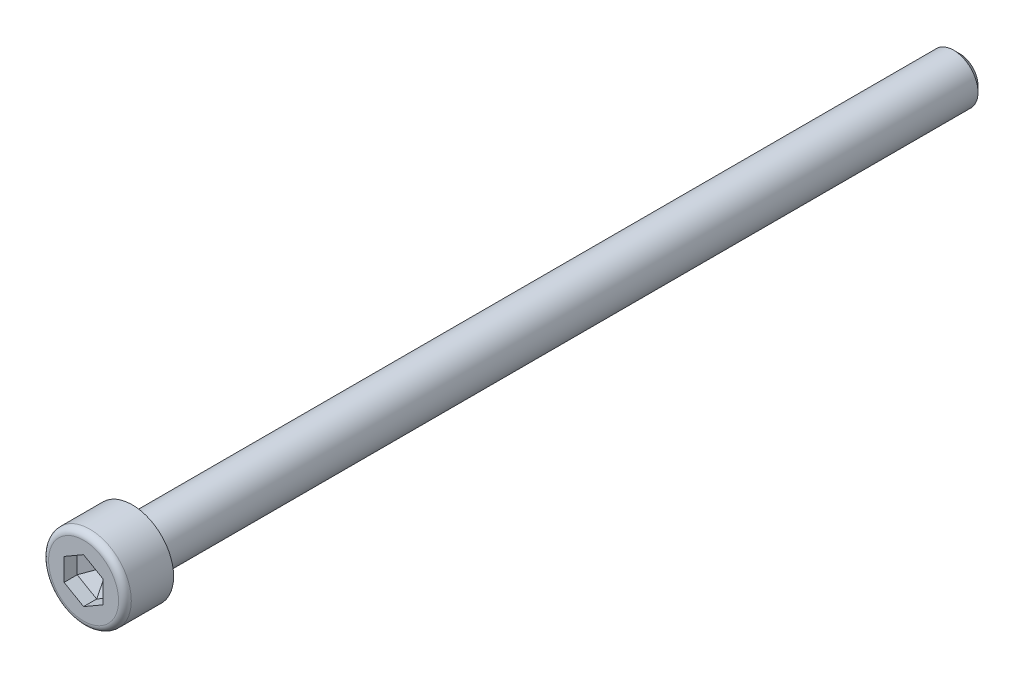
ISO-10303-21;
HEADER;
FILE_DESCRIPTION(('STEP AP214'),'2;1');
FILE_NAME('part.step','',(''),(''),'','','');
FILE_SCHEMA(('AUTOMOTIVE_DESIGN { 1 0 10303 214 1 1 1 1 }'));
ENDSEC;
DATA;
#1=APPLICATION_CONTEXT('core data for automotive mechanical design processes');
#2=APPLICATION_PROTOCOL_DEFINITION('international standard','automotive_design',2000,#1);
#3=PRODUCT_CONTEXT('',#1,'mechanical');
#4=PRODUCT('Part','Part','',(#3));
#5=PRODUCT_RELATED_PRODUCT_CATEGORY('part','',(#4));
#6=PRODUCT_DEFINITION_FORMATION('','',#4);
#7=PRODUCT_DEFINITION_CONTEXT('part definition',#1,'design');
#8=PRODUCT_DEFINITION('design','',#6,#7);
#9=PRODUCT_DEFINITION_SHAPE('','',#8);
#10=(LENGTH_UNIT() NAMED_UNIT(*) SI_UNIT(.MILLI.,.METRE.));
#11=(NAMED_UNIT(*) PLANE_ANGLE_UNIT() SI_UNIT($,.RADIAN.));
#12=(NAMED_UNIT(*) SI_UNIT($,.STERADIAN.) SOLID_ANGLE_UNIT());
#13=UNCERTAINTY_MEASURE_WITH_UNIT(LENGTH_MEASURE(1.E-05),#10,'distance_accuracy_value','');
#14=(GEOMETRIC_REPRESENTATION_CONTEXT(3) GLOBAL_UNCERTAINTY_ASSIGNED_CONTEXT((#13)) GLOBAL_UNIT_ASSIGNED_CONTEXT((#10,
#11,#12)) REPRESENTATION_CONTEXT('',''));
#15=CARTESIAN_POINT('',(0.,0.,0.));
#16=DIRECTION('',(0.,0.,1.));
#17=DIRECTION('',(1.,0.,0.));
#18=AXIS2_PLACEMENT_3D('',#15,#16,#17);
#19=CARTESIAN_POINT('',(0.,0.,0.));
#20=DIRECTION('',(0.,0.,1.));
#21=DIRECTION('',(1.,0.,0.));
#22=AXIS2_PLACEMENT_3D('',#19,#20,#21);
#23=PLANE('',#22);
#24=CARTESIAN_POINT('',(0.,0.,0.));
#25=DIRECTION('',(0.,0.,1.));
#26=DIRECTION('',(1.,0.,0.));
#27=AXIS2_PLACEMENT_3D('',#24,#25,#26);
#28=CIRCLE('',#27,2.6);
#29=CARTESIAN_POINT('',(2.6,0.,0.));
#30=VERTEX_POINT('',#29);
#31=EDGE_CURVE('E11',#30,#30,#28,.T.);
#32=ORIENTED_EDGE('',*,*,#31,.T.);
#33=EDGE_LOOP('',(#32));
#34=FACE_BOUND('',#33,.T.);
#35=CARTESIAN_POINT('',(0.,0.,0.));
#36=DIRECTION('',(0.,0.,1.));
#37=DIRECTION('',(1.,0.,0.));
#38=AXIS2_PLACEMENT_3D('',#35,#36,#37);
#39=CIRCLE('',#38,4.25);
#40=CARTESIAN_POINT('',(4.25,0.,0.));
#41=VERTEX_POINT('',#40);
#42=EDGE_CURVE('E154',#41,#41,#39,.T.);
#43=ORIENTED_EDGE('',*,*,#42,.F.);
#44=EDGE_LOOP('',(#43));
#45=FACE_BOUND('',#44,.T.);
#46=ADVANCED_FACE('F44',(#34,#45),#23,.F.);
#47=CARTESIAN_POINT('',(0.,0.,5.));
#48=DIRECTION('',(0.,0.,-1.));
#49=DIRECTION('',(-1.,0.,0.));
#50=AXIS2_PLACEMENT_3D('',#47,#48,#49);
#51=CYLINDRICAL_SURFACE('',#50,4.25);
#52=CARTESIAN_POINT('',(0.,0.,4.34615384615385));
#53=DIRECTION('',(0.,0.,1.));
#54=DIRECTION('',(1.,0.,0.));
#55=AXIS2_PLACEMENT_3D('',#52,#53,#54);
#56=CIRCLE('',#55,4.25);
#57=CARTESIAN_POINT('',(4.25,0.,4.34615384615385));
#58=VERTEX_POINT('',#57);
#59=EDGE_CURVE('E172',#58,#58,#56,.F.);
#60=ORIENTED_EDGE('',*,*,#59,.T.);
#61=EDGE_LOOP('',(#60));
#62=FACE_BOUND('',#61,.T.);
#63=ORIENTED_EDGE('',*,*,#42,.T.);
#64=EDGE_LOOP('',(#63));
#65=FACE_BOUND('',#64,.T.);
#66=ADVANCED_FACE('F231',(#62,#65),#51,.T.);
#67=CARTESIAN_POINT('',(0.,0.,5.));
#68=DIRECTION('',(0.,0.,1.));
#69=DIRECTION('',(1.,0.,0.));
#70=AXIS2_PLACEMENT_3D('',#67,#68,#69);
#71=PLANE('',#70);
#72=CARTESIAN_POINT('',(0.,0.,5.));
#73=DIRECTION('',(0.,0.,1.));
#74=DIRECTION('',(1.,0.,0.));
#75=AXIS2_PLACEMENT_3D('',#72,#73,#74);
#76=CIRCLE('',#75,3.59615384615385);
#77=CARTESIAN_POINT('',(3.59615384615385,0.,5.));
#78=VERTEX_POINT('',#77);
#79=EDGE_CURVE('E169',#78,#78,#76,.T.);
#80=ORIENTED_EDGE('',*,*,#79,.T.);
#81=EDGE_LOOP('',(#80));
#82=FACE_BOUND('',#81,.T.);
#83=DIRECTION('',(0.,1.,0.));
#84=VECTOR('',#83,1.);
#85=CARTESIAN_POINT('',(2.,-1.15470053837925,5.));
#86=LINE('',#85,#84);
#87=CARTESIAN_POINT('',(2.,-1.15470053837925,5.));
#88=VERTEX_POINT('',#87);
#89=CARTESIAN_POINT('',(2.,1.15470053837925,5.));
#90=VERTEX_POINT('',#89);
#91=EDGE_CURVE('E136',#88,#90,#86,.T.);
#92=ORIENTED_EDGE('',*,*,#91,.F.);
#93=DIRECTION('',(0.866025403784439,0.5,0.));
#94=VECTOR('',#93,1.);
#95=CARTESIAN_POINT('',(0.,-2.3094010767585,5.));
#96=LINE('',#95,#94);
#97=CARTESIAN_POINT('',(0.,-2.3094010767585,5.));
#98=VERTEX_POINT('',#97);
#99=EDGE_CURVE('E149',#98,#88,#96,.T.);
#100=ORIENTED_EDGE('',*,*,#99,.F.);
#101=DIRECTION('',(0.866025403784439,-0.5,0.));
#102=VECTOR('',#101,1.);
#103=CARTESIAN_POINT('',(-2.,-1.15470053837925,5.));
#104=LINE('',#103,#102);
#105=CARTESIAN_POINT('',(-2.,-1.15470053837925,5.));
#106=VERTEX_POINT('',#105);
#107=EDGE_CURVE('E143',#106,#98,#104,.T.);
#108=ORIENTED_EDGE('',*,*,#107,.F.);
#109=DIRECTION('',(0.,-1.,0.));
#110=VECTOR('',#109,1.);
#111=CARTESIAN_POINT('',(-2.,1.15470053837925,5.));
#112=LINE('',#111,#110);
#113=CARTESIAN_POINT('',(-2.,1.15470053837925,5.));
#114=VERTEX_POINT('',#113);
#115=EDGE_CURVE('E141',#114,#106,#112,.T.);
#116=ORIENTED_EDGE('',*,*,#115,.F.);
#117=DIRECTION('',(-0.866025403784439,-0.5,0.));
#118=VECTOR('',#117,1.);
#119=CARTESIAN_POINT('',(0.,2.3094010767585,5.));
#120=LINE('',#119,#118);
#121=CARTESIAN_POINT('',(0.,2.3094010767585,5.));
#122=VERTEX_POINT('',#121);
#123=EDGE_CURVE('E121',#122,#114,#120,.T.);
#124=ORIENTED_EDGE('',*,*,#123,.F.);
#125=DIRECTION('',(-0.866025403784439,0.5,0.));
#126=VECTOR('',#125,1.);
#127=CARTESIAN_POINT('',(2.,1.15470053837925,5.));
#128=LINE('',#127,#126);
#129=EDGE_CURVE('E131',#90,#122,#128,.T.);
#130=ORIENTED_EDGE('',*,*,#129,.F.);
#131=EDGE_LOOP('',(#92,#100,#108,#116,#124,#130));
#132=FACE_BOUND('',#131,.T.);
#133=ADVANCED_FACE('F138',(#82,#132),#71,.T.);
#134=CARTESIAN_POINT('',(2.,-1.15470053837925,2.5));
#135=DIRECTION('',(1.,0.,0.));
#136=DIRECTION('',(0.,0.,-1.));
#137=AXIS2_PLACEMENT_3D('',#134,#135,#136);
#138=PLANE('',#137);
#139=DIRECTION('',(0.,0.,1.));
#140=VECTOR('',#139,1.);
#141=CARTESIAN_POINT('',(2.,1.15470053837925,2.5));
#142=LINE('',#141,#140);
#143=CARTESIAN_POINT('',(2.,1.15470053837925,3.65273775216138));
#144=VERTEX_POINT('',#143);
#145=EDGE_CURVE('E128',#144,#90,#142,.T.);
#146=ORIENTED_EDGE('',*,*,#145,.F.);
#147=DIRECTION('',(0.,-1.,0.));
#148=VECTOR('',#147,1.);
#149=CARTESIAN_POINT('',(2.,-1.15470053837925,3.65273775216138));
#150=LINE('',#149,#148);
#151=CARTESIAN_POINT('',(2.,-1.15470053837925,3.65273775216138));
#152=VERTEX_POINT('',#151);
#153=EDGE_CURVE('E67',#144,#152,#150,.T.);
#154=ORIENTED_EDGE('',*,*,#153,.T.);
#155=DIRECTION('',(0.,0.,1.));
#156=VECTOR('',#155,1.);
#157=CARTESIAN_POINT('',(2.,-1.15470053837925,2.5));
#158=LINE('',#157,#156);
#159=EDGE_CURVE('E152',#152,#88,#158,.T.);
#160=ORIENTED_EDGE('',*,*,#159,.T.);
#161=ORIENTED_EDGE('',*,*,#91,.T.);
#162=EDGE_LOOP('',(#146,#154,#160,#161));
#163=FACE_BOUND('',#162,.T.);
#164=ADVANCED_FACE('F291',(#163),#138,.F.);
#165=CARTESIAN_POINT('',(0.,-2.3094010767585,2.5));
#166=DIRECTION('',(0.5,-0.866025403784439,0.));
#167=DIRECTION('',(0.866025403784439,0.5,0.));
#168=AXIS2_PLACEMENT_3D('',#165,#166,#167);
#169=PLANE('',#168);
#170=ORIENTED_EDGE('',*,*,#159,.F.);
#171=DIRECTION('',(-0.866025403784439,-0.5,0.));
#172=VECTOR('',#171,1.);
#173=CARTESIAN_POINT('',(0.,-2.3094010767585,3.65273775216138));
#174=LINE('',#173,#172);
#175=CARTESIAN_POINT('',(0.,-2.3094010767585,3.65273775216138));
#176=VERTEX_POINT('',#175);
#177=EDGE_CURVE('E59',#152,#176,#174,.T.);
#178=ORIENTED_EDGE('',*,*,#177,.T.);
#179=DIRECTION('',(0.,0.,1.));
#180=VECTOR('',#179,1.);
#181=CARTESIAN_POINT('',(0.,-2.3094010767585,2.5));
#182=LINE('',#181,#180);
#183=EDGE_CURVE('E155',#176,#98,#182,.T.);
#184=ORIENTED_EDGE('',*,*,#183,.T.);
#185=ORIENTED_EDGE('',*,*,#99,.T.);
#186=EDGE_LOOP('',(#170,#178,#184,#185));
#187=FACE_BOUND('',#186,.T.);
#188=ADVANCED_FACE('F293',(#187),#169,.F.);
#189=CARTESIAN_POINT('',(-2.,-1.15470053837925,2.5));
#190=DIRECTION('',(-0.5,-0.866025403784439,0.));
#191=DIRECTION('',(0.866025403784439,-0.5,0.));
#192=AXIS2_PLACEMENT_3D('',#189,#190,#191);
#193=PLANE('',#192);
#194=ORIENTED_EDGE('',*,*,#183,.F.);
#195=DIRECTION('',(-0.866025403784439,0.5,0.));
#196=VECTOR('',#195,1.);
#197=CARTESIAN_POINT('',(-2.,-1.15470053837925,3.65273775216138));
#198=LINE('',#197,#196);
#199=CARTESIAN_POINT('',(-2.,-1.15470053837925,3.65273775216138));
#200=VERTEX_POINT('',#199);
#201=EDGE_CURVE('E195',#176,#200,#198,.T.);
#202=ORIENTED_EDGE('',*,*,#201,.T.);
#203=DIRECTION('',(0.,0.,1.));
#204=VECTOR('',#203,1.);
#205=CARTESIAN_POINT('',(-2.,-1.15470053837925,2.5));
#206=LINE('',#205,#204);
#207=EDGE_CURVE('E157',#200,#106,#206,.T.);
#208=ORIENTED_EDGE('',*,*,#207,.T.);
#209=ORIENTED_EDGE('',*,*,#107,.T.);
#210=EDGE_LOOP('',(#194,#202,#208,#209));
#211=FACE_BOUND('',#210,.T.);
#212=ADVANCED_FACE('F282',(#211),#193,.F.);
#213=CARTESIAN_POINT('',(-2.,1.15470053837925,2.5));
#214=DIRECTION('',(-1.,0.,0.));
#215=DIRECTION('',(0.,0.,1.));
#216=AXIS2_PLACEMENT_3D('',#213,#214,#215);
#217=PLANE('',#216);
#218=ORIENTED_EDGE('',*,*,#207,.F.);
#219=DIRECTION('',(0.,1.,0.));
#220=VECTOR('',#219,1.);
#221=CARTESIAN_POINT('',(-2.,1.15470053837925,3.65273775216138));
#222=LINE('',#221,#220);
#223=CARTESIAN_POINT('',(-2.,1.15470053837925,3.65273775216138));
#224=VERTEX_POINT('',#223);
#225=EDGE_CURVE('E188',#200,#224,#222,.T.);
#226=ORIENTED_EDGE('',*,*,#225,.T.);
#227=DIRECTION('',(0.,0.,1.));
#228=VECTOR('',#227,1.);
#229=CARTESIAN_POINT('',(-2.,1.15470053837925,2.5));
#230=LINE('',#229,#228);
#231=EDGE_CURVE('E127',#224,#114,#230,.T.);
#232=ORIENTED_EDGE('',*,*,#231,.T.);
#233=ORIENTED_EDGE('',*,*,#115,.T.);
#234=EDGE_LOOP('',(#218,#226,#232,#233));
#235=FACE_BOUND('',#234,.T.);
#236=ADVANCED_FACE('F285',(#235),#217,.F.);
#237=CARTESIAN_POINT('',(0.,2.3094010767585,2.5));
#238=DIRECTION('',(-0.5,0.866025403784439,0.));
#239=DIRECTION('',(-0.866025403784439,-0.5,0.));
#240=AXIS2_PLACEMENT_3D('',#237,#238,#239);
#241=PLANE('',#240);
#242=ORIENTED_EDGE('',*,*,#231,.F.);
#243=DIRECTION('',(0.866025403784439,0.5,0.));
#244=VECTOR('',#243,1.);
#245=CARTESIAN_POINT('',(0.,2.3094010767585,3.65273775216138));
#246=LINE('',#245,#244);
#247=CARTESIAN_POINT('',(0.,2.3094010767585,3.65273775216138));
#248=VERTEX_POINT('',#247);
#249=EDGE_CURVE('E124',#224,#248,#246,.T.);
#250=ORIENTED_EDGE('',*,*,#249,.T.);
#251=DIRECTION('',(0.,0.,1.));
#252=VECTOR('',#251,1.);
#253=CARTESIAN_POINT('',(0.,2.3094010767585,2.5));
#254=LINE('',#253,#252);
#255=EDGE_CURVE('E116',#248,#122,#254,.T.);
#256=ORIENTED_EDGE('',*,*,#255,.T.);
#257=ORIENTED_EDGE('',*,*,#123,.T.);
#258=EDGE_LOOP('',(#242,#250,#256,#257));
#259=FACE_BOUND('',#258,.T.);
#260=ADVANCED_FACE('F119',(#259),#241,.F.);
#261=CARTESIAN_POINT('',(2.,1.15470053837925,2.5));
#262=DIRECTION('',(0.5,0.866025403784439,0.));
#263=DIRECTION('',(-0.866025403784439,0.5,0.));
#264=AXIS2_PLACEMENT_3D('',#261,#262,#263);
#265=PLANE('',#264);
#266=ORIENTED_EDGE('',*,*,#255,.F.);
#267=DIRECTION('',(0.866025403784439,-0.5,0.));
#268=VECTOR('',#267,1.);
#269=CARTESIAN_POINT('',(2.,1.15470053837925,3.65273775216138));
#270=LINE('',#269,#268);
#271=EDGE_CURVE('E192',#248,#144,#270,.T.);
#272=ORIENTED_EDGE('',*,*,#271,.T.);
#273=ORIENTED_EDGE('',*,*,#145,.T.);
#274=ORIENTED_EDGE('',*,*,#129,.T.);
#275=EDGE_LOOP('',(#266,#272,#273,#274));
#276=FACE_BOUND('',#275,.T.);
#277=ADVANCED_FACE('F132',(#276),#265,.F.);
#278=CARTESIAN_POINT('',(0.,0.,2.5));
#279=DIRECTION('',(0.,0.,1.));
#280=DIRECTION('',(1.,0.,0.));
#281=AXIS2_PLACEMENT_3D('',#278,#279,#280);
#282=PLANE('',#281);
#283=DIRECTION('',(-0.866025403784439,-0.5,0.));
#284=VECTOR('',#283,1.);
#285=CARTESIAN_POINT('',(-0.00169982272685992,0.00294417932678165,2.5));
#286=LINE('',#285,#284);
#287=CARTESIAN_POINT('',(0.,0.00392557243570869,2.5));
#288=VERTEX_POINT('',#287);
#289=CARTESIAN_POINT('',(-0.00339964545371935,0.00196278621785459,2.5));
#290=VERTEX_POINT('',#289);
#291=EDGE_CURVE('E183',#288,#290,#286,.T.);
#292=ORIENTED_EDGE('',*,*,#291,.T.);
#293=DIRECTION('',(0.,-1.,0.));
#294=VECTOR('',#293,1.);
#295=CARTESIAN_POINT('',(-0.0033996454537194,0.,2.5));
#296=LINE('',#295,#294);
#297=CARTESIAN_POINT('',(-0.0033996454537194,-0.00196278621785428,2.5));
#298=VERTEX_POINT('',#297);
#299=EDGE_CURVE('E185',#290,#298,#296,.T.);
#300=ORIENTED_EDGE('',*,*,#299,.T.);
#301=DIRECTION('',(0.866025403784439,-0.5,0.));
#302=VECTOR('',#301,1.);
#303=CARTESIAN_POINT('',(-0.00169982272685976,-0.00294417932678137,2.5));
#304=LINE('',#303,#302);
#305=CARTESIAN_POINT('',(0.,-0.00392557243570875,2.5));
#306=VERTEX_POINT('',#305);
#307=EDGE_CURVE('E177',#298,#306,#304,.T.);
#308=ORIENTED_EDGE('',*,*,#307,.T.);
#309=DIRECTION('',(0.866025403784439,0.5,0.));
#310=VECTOR('',#309,1.);
#311=CARTESIAN_POINT('',(0.00169982272685997,-0.00294417932678175,2.5));
#312=LINE('',#311,#310);
#313=CARTESIAN_POINT('',(0.0033996454537194,-0.00196278621785478,2.5));
#314=VERTEX_POINT('',#313);
#315=EDGE_CURVE('E175',#306,#314,#312,.T.);
#316=ORIENTED_EDGE('',*,*,#315,.T.);
#317=DIRECTION('',(0.,1.,0.));
#318=VECTOR('',#317,1.);
#319=CARTESIAN_POINT('',(0.0033996454537194,0.,2.5));
#320=LINE('',#319,#318);
#321=CARTESIAN_POINT('',(0.0033996454537194,0.00196278621785453,2.5));
#322=VERTEX_POINT('',#321);
#323=EDGE_CURVE('E179',#314,#322,#320,.T.);
#324=ORIENTED_EDGE('',*,*,#323,.T.);
#325=DIRECTION('',(-0.866025403784439,0.5,0.));
#326=VECTOR('',#325,1.);
#327=CARTESIAN_POINT('',(0.00169982272685981,0.00294417932678146,2.5));
#328=LINE('',#327,#326);
#329=EDGE_CURVE('E181',#322,#288,#328,.T.);
#330=ORIENTED_EDGE('',*,*,#329,.T.);
#331=EDGE_LOOP('',(#292,#300,#308,#316,#324,#330));
#332=FACE_BOUND('',#331,.T.);
#333=ADVANCED_FACE('F302',(#332),#282,.T.);
#334=CARTESIAN_POINT('',(0.,0.,-85.));
#335=DIRECTION('',(0.,0.,1.));
#336=DIRECTION('',(1.,0.,0.));
#337=AXIS2_PLACEMENT_3D('',#334,#335,#336);
#338=CYLINDRICAL_SURFACE('',#337,2.5);
#339=CARTESIAN_POINT('',(0.,0.,-0.100000000000003));
#340=DIRECTION('',(0.,0.,1.));
#341=DIRECTION('',(1.,0.,0.));
#342=AXIS2_PLACEMENT_3D('',#339,#340,#341);
#343=CIRCLE('',#342,2.5);
#344=CARTESIAN_POINT('',(2.5,0.,-0.100000000000003));
#345=VERTEX_POINT('',#344);
#346=EDGE_CURVE('E52',#345,#345,#343,.F.);
#347=ORIENTED_EDGE('',*,*,#346,.T.);
#348=EDGE_LOOP('',(#347));
#349=FACE_BOUND('',#348,.T.);
#350=CARTESIAN_POINT('',(0.,0.,-84.375));
#351=DIRECTION('',(0.,0.,-1.));
#352=DIRECTION('',(-1.,0.,0.));
#353=AXIS2_PLACEMENT_3D('',#350,#351,#352);
#354=CIRCLE('',#353,2.5);
#355=CARTESIAN_POINT('',(-2.5,0.,-84.375));
#356=VERTEX_POINT('',#355);
#357=EDGE_CURVE('E166',#356,#356,#354,.F.);
#358=ORIENTED_EDGE('',*,*,#357,.T.);
#359=EDGE_LOOP('',(#358));
#360=FACE_BOUND('',#359,.T.);
#361=ADVANCED_FACE('F216',(#349,#360),#338,.T.);
#362=CARTESIAN_POINT('',(0.,0.,-85.));
#363=DIRECTION('',(0.,0.,-1.));
#364=DIRECTION('',(-1.,0.,0.));
#365=AXIS2_PLACEMENT_3D('',#362,#363,#364);
#366=PLANE('',#365);
#367=CARTESIAN_POINT('',(0.,0.,-85.));
#368=DIRECTION('',(0.,0.,-1.));
#369=DIRECTION('',(-1.,0.,0.));
#370=AXIS2_PLACEMENT_3D('',#367,#368,#369);
#371=CIRCLE('',#370,1.87499999999999);
#372=CARTESIAN_POINT('',(-1.87499999999999,0.,-85.));
#373=VERTEX_POINT('',#372);
#374=EDGE_CURVE('E163',#373,#373,#371,.T.);
#375=ORIENTED_EDGE('',*,*,#374,.T.);
#376=EDGE_LOOP('',(#375));
#377=FACE_BOUND('',#376,.T.);
#378=ADVANCED_FACE('F247',(#377),#366,.T.);
#379=CARTESIAN_POINT('',(0.,0.,-85.));
#380=DIRECTION('',(0.,0.,1.));
#381=DIRECTION('',(1.,0.,0.));
#382=AXIS2_PLACEMENT_3D('',#379,#380,#381);
#383=CONICAL_SURFACE('',#382,1.87499999999999,0.785398163397458);
#384=ORIENTED_EDGE('',*,*,#357,.F.);
#385=EDGE_LOOP('',(#384));
#386=FACE_BOUND('',#385,.T.);
#387=ORIENTED_EDGE('',*,*,#374,.F.);
#388=EDGE_LOOP('',(#387));
#389=FACE_BOUND('',#388,.T.);
#390=ADVANCED_FACE('F243',(#386,#389),#383,.T.);
#391=CARTESIAN_POINT('',(0.,0.,4.34615384615385));
#392=DIRECTION('',(0.,0.,1.));
#393=DIRECTION('',(1.,0.,0.));
#394=AXIS2_PLACEMENT_3D('',#391,#392,#393);
#395=TOROIDAL_SURFACE('',#394,3.59615384615385,0.653846153846154);
#396=ORIENTED_EDGE('',*,*,#59,.F.);
#397=EDGE_LOOP('',(#396));
#398=FACE_BOUND('',#397,.T.);
#399=ORIENTED_EDGE('',*,*,#79,.F.);
#400=EDGE_LOOP('',(#399));
#401=FACE_BOUND('',#400,.T.);
#402=ADVANCED_FACE('F246',(#398,#401),#395,.T.);
#403=CARTESIAN_POINT('',(0.0033996454537194,0.,2.5));
#404=DIRECTION('',(0.499999999999995,0.,-0.866025403784441));
#405=DIRECTION('',(0.,1.,0.));
#406=AXIS2_PLACEMENT_3D('',#403,#404,#405);
#407=PLANE('',#406);
#408=DIRECTION('',(-0.774596669241485,0.447213595499959,-0.447213595499953));
#409=VECTOR('',#408,1.);
#410=CARTESIAN_POINT('',(0.0027197163629753,-0.00157022897428385,2.49960744275643));
#411=LINE('',#410,#409);
#412=EDGE_CURVE('E208',#152,#314,#411,.T.);
#413=ORIENTED_EDGE('',*,*,#412,.F.);
#414=ORIENTED_EDGE('',*,*,#153,.F.);
#415=DIRECTION('',(-0.774596669241485,-0.447213595499959,-0.447213595499953));
#416=VECTOR('',#415,1.);
#417=CARTESIAN_POINT('',(0.00271971636297556,0.00157022897428362,2.49960744275643));
#418=LINE('',#417,#416);
#419=EDGE_CURVE('E211',#322,#144,#418,.F.);
#420=ORIENTED_EDGE('',*,*,#419,.F.);
#421=ORIENTED_EDGE('',*,*,#323,.F.);
#422=EDGE_LOOP('',(#413,#414,#420,#421));
#423=FACE_BOUND('',#422,.T.);
#424=ADVANCED_FACE('F250',(#423),#407,.F.);
#425=CARTESIAN_POINT('',(0.00169982272685981,0.00294417932678146,2.5));
#426=DIRECTION('',(0.249999999999998,0.433012701892215,-0.866025403784441));
#427=DIRECTION('',(-0.866025403784439,0.5,0.));
#428=AXIS2_PLACEMENT_3D('',#425,#426,#427);
#429=PLANE('',#428);
#430=ORIENTED_EDGE('',*,*,#419,.T.);
#431=ORIENTED_EDGE('',*,*,#271,.F.);
#432=DIRECTION('',(0.,-0.894427190999918,-0.447213595499953));
#433=VECTOR('',#432,1.);
#434=CARTESIAN_POINT('',(0.,0.00314045794856707,2.49960744275643));
#435=LINE('',#434,#433);
#436=EDGE_CURVE('E205',#288,#248,#435,.F.);
#437=ORIENTED_EDGE('',*,*,#436,.F.);
#438=ORIENTED_EDGE('',*,*,#329,.F.);
#439=EDGE_LOOP('',(#430,#431,#437,#438));
#440=FACE_BOUND('',#439,.T.);
#441=ADVANCED_FACE('F263',(#440),#429,.F.);
#442=CARTESIAN_POINT('',(0.00169982272685997,-0.00294417932678175,2.5));
#443=DIRECTION('',(0.249999999999997,-0.433012701892215,-0.866025403784441));
#444=DIRECTION('',(0.866025403784439,0.5,0.));
#445=AXIS2_PLACEMENT_3D('',#442,#443,#444);
#446=PLANE('',#445);
#447=ORIENTED_EDGE('',*,*,#412,.T.);
#448=ORIENTED_EDGE('',*,*,#315,.F.);
#449=DIRECTION('',(0.,-0.894427190999918,0.447213595499953));
#450=VECTOR('',#449,1.);
#451=CARTESIAN_POINT('',(0.,-0.00314045794856693,2.49960744275643));
#452=LINE('',#451,#450);
#453=EDGE_CURVE('E202',#176,#306,#452,.F.);
#454=ORIENTED_EDGE('',*,*,#453,.F.);
#455=ORIENTED_EDGE('',*,*,#177,.F.);
#456=EDGE_LOOP('',(#447,#448,#454,#455));
#457=FACE_BOUND('',#456,.T.);
#458=ADVANCED_FACE('F259',(#457),#446,.F.);
#459=CARTESIAN_POINT('',(-0.00169982272685992,0.00294417932678165,2.5));
#460=DIRECTION('',(-0.249999999999998,0.433012701892215,-0.866025403784441));
#461=DIRECTION('',(-0.866025403784439,-0.5,0.));
#462=AXIS2_PLACEMENT_3D('',#459,#460,#461);
#463=PLANE('',#462);
#464=ORIENTED_EDGE('',*,*,#436,.T.);
#465=ORIENTED_EDGE('',*,*,#249,.F.);
#466=DIRECTION('',(0.774596669241485,-0.447213595499959,-0.447213595499953));
#467=VECTOR('',#466,1.);
#468=CARTESIAN_POINT('',(-0.00271971636297534,0.00157022897428375,2.49960744275643));
#469=LINE('',#468,#467);
#470=EDGE_CURVE('E200',#290,#224,#469,.F.);
#471=ORIENTED_EDGE('',*,*,#470,.F.);
#472=ORIENTED_EDGE('',*,*,#291,.F.);
#473=EDGE_LOOP('',(#464,#465,#471,#472));
#474=FACE_BOUND('',#473,.T.);
#475=ADVANCED_FACE('F255',(#474),#463,.F.);
#476=CARTESIAN_POINT('',(-0.00169982272685981,-0.00294417932678146,2.5));
#477=DIRECTION('',(-0.249999999999998,-0.433012701892215,-0.866025403784441));
#478=DIRECTION('',(0.866025403784439,-0.5,0.));
#479=AXIS2_PLACEMENT_3D('',#476,#477,#478);
#480=PLANE('',#479);
#481=ORIENTED_EDGE('',*,*,#453,.T.);
#482=ORIENTED_EDGE('',*,*,#307,.F.);
#483=DIRECTION('',(-0.774596669241485,-0.447213595499959,0.447213595499953));
#484=VECTOR('',#483,1.);
#485=CARTESIAN_POINT('',(-0.00271971636297543,-0.00157022897428355,2.49960744275643));
#486=LINE('',#485,#484);
#487=EDGE_CURVE('E198',#200,#298,#486,.F.);
#488=ORIENTED_EDGE('',*,*,#487,.F.);
#489=ORIENTED_EDGE('',*,*,#201,.F.);
#490=EDGE_LOOP('',(#481,#482,#488,#489));
#491=FACE_BOUND('',#490,.T.);
#492=ADVANCED_FACE('F226',(#491),#480,.F.);
#493=CARTESIAN_POINT('',(-0.0033996454537194,0.,2.5));
#494=DIRECTION('',(-0.499999999999995,0.,-0.866025403784441));
#495=DIRECTION('',(0.,-1.,0.));
#496=AXIS2_PLACEMENT_3D('',#493,#494,#495);
#497=PLANE('',#496);
#498=ORIENTED_EDGE('',*,*,#470,.T.);
#499=ORIENTED_EDGE('',*,*,#225,.F.);
#500=ORIENTED_EDGE('',*,*,#487,.T.);
#501=ORIENTED_EDGE('',*,*,#299,.F.);
#502=EDGE_LOOP('',(#498,#499,#500,#501));
#503=FACE_BOUND('',#502,.T.);
#504=ADVANCED_FACE('F220',(#503),#497,.F.);
#505=CARTESIAN_POINT('',(0.,0.,-0.100000000000003));
#506=DIRECTION('',(0.,0.,1.));
#507=DIRECTION('',(1.,0.,0.));
#508=AXIS2_PLACEMENT_3D('',#505,#506,#507);
#509=TOROIDAL_SURFACE('',#508,2.6,0.1);
#510=ORIENTED_EDGE('',*,*,#31,.F.);
#511=EDGE_LOOP('',(#510));
#512=FACE_BOUND('',#511,.T.);
#513=ORIENTED_EDGE('',*,*,#346,.F.);
#514=EDGE_LOOP('',(#513));
#515=FACE_BOUND('',#514,.T.);
#516=ADVANCED_FACE('F46',(#512,#515),#509,.F.);
#517=CLOSED_SHELL('',(#46,#66,#133,#164,#188,#212,#236,#260,#277,#333,#361,#378,#390,#402,#424,
#441,#458,#475,#492,#504,#516));
#518=MANIFOLD_SOLID_BREP('B2',#517);
#519=ADVANCED_BREP_SHAPE_REPRESENTATION('',(#18,#518),#14);
#520=SHAPE_DEFINITION_REPRESENTATION(#9,#519);
ENDSEC;
END-ISO-10303-21;
